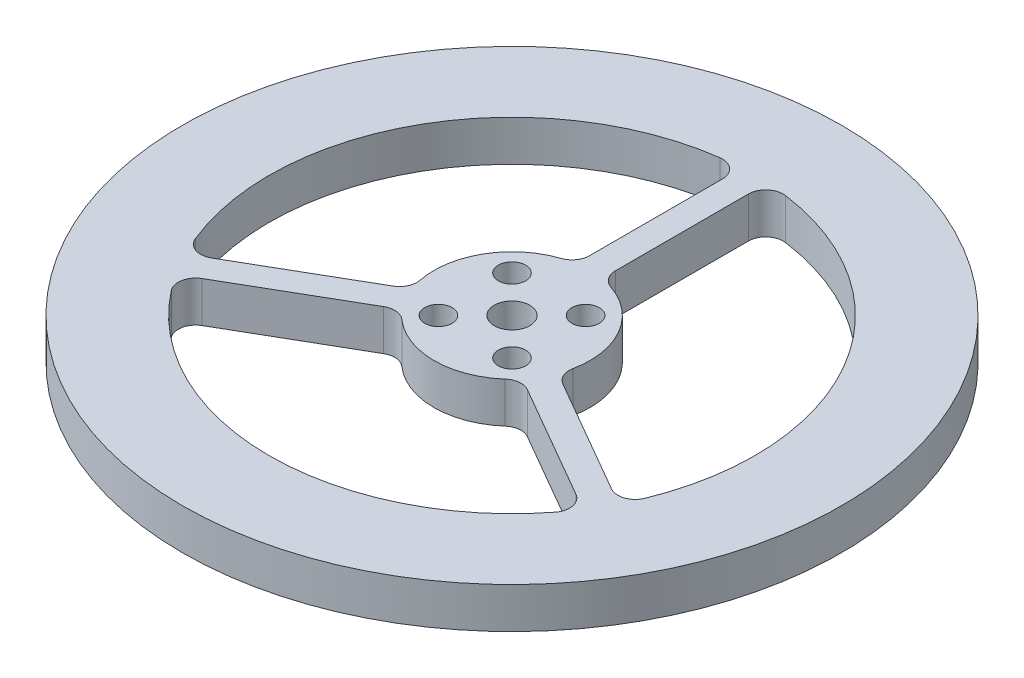
ISO-10303-21;
HEADER;
FILE_DESCRIPTION(('STEP AP214'),'2;1');
FILE_NAME('part.step','',(''),(''),'','','');
FILE_SCHEMA(('AUTOMOTIVE_DESIGN { 1 0 10303 214 1 1 1 1 }'));
ENDSEC;
DATA;
#1=APPLICATION_CONTEXT('core data for automotive mechanical design processes');
#2=APPLICATION_PROTOCOL_DEFINITION('international standard','automotive_design',2000,#1);
#3=PRODUCT_CONTEXT('',#1,'mechanical');
#4=PRODUCT('Part','Part','',(#3));
#5=PRODUCT_RELATED_PRODUCT_CATEGORY('part','',(#4));
#6=PRODUCT_DEFINITION_FORMATION('','',#4);
#7=PRODUCT_DEFINITION_CONTEXT('part definition',#1,'design');
#8=PRODUCT_DEFINITION('design','',#6,#7);
#9=PRODUCT_DEFINITION_SHAPE('','',#8);
#10=(LENGTH_UNIT() NAMED_UNIT(*) SI_UNIT(.MILLI.,.METRE.));
#11=(NAMED_UNIT(*) PLANE_ANGLE_UNIT() SI_UNIT($,.RADIAN.));
#12=(NAMED_UNIT(*) SI_UNIT($,.STERADIAN.) SOLID_ANGLE_UNIT());
#13=UNCERTAINTY_MEASURE_WITH_UNIT(LENGTH_MEASURE(1.E-05),#10,'distance_accuracy_value','');
#14=(GEOMETRIC_REPRESENTATION_CONTEXT(3) GLOBAL_UNCERTAINTY_ASSIGNED_CONTEXT((#13)) GLOBAL_UNIT_ASSIGNED_CONTEXT((#10,
#11,#12)) REPRESENTATION_CONTEXT('',''));
#15=CARTESIAN_POINT('',(0.,0.,0.));
#16=DIRECTION('',(0.,0.,1.));
#17=DIRECTION('',(1.,0.,0.));
#18=AXIS2_PLACEMENT_3D('',#15,#16,#17);
#19=CARTESIAN_POINT('',(0.,4.7,0.));
#20=DIRECTION('',(0.,-1.,0.));
#21=DIRECTION('',(0.,0.,-1.));
#22=AXIS2_PLACEMENT_3D('',#19,#20,#21);
#23=CYLINDRICAL_SURFACE('',#22,28.);
#24=CARTESIAN_POINT('',(0.,4.7,0.));
#25=DIRECTION('',(0.,1.,0.));
#26=DIRECTION('',(0.,0.,1.));
#27=AXIS2_PLACEMENT_3D('',#24,#25,#26);
#28=CIRCLE('',#27,28.);
#29=CARTESIAN_POINT('',(-22.1433823379621,4.7,17.1368205520986));
#30=VERTEX_POINT('',#29);
#31=CARTESIAN_POINT('',(22.143382337963,4.7,17.1368205520975));
#32=VERTEX_POINT('',#31);
#33=EDGE_CURVE('E383',#30,#32,#28,.T.);
#34=ORIENTED_EDGE('',*,*,#33,.T.);
#35=DIRECTION('',(0.,-1.,0.));
#36=VECTOR('',#35,1.);
#37=CARTESIAN_POINT('',(22.143382337963,4.7,17.1368205520975));
#38=LINE('',#37,#36);
#39=CARTESIAN_POINT('',(22.143382337963,0.,17.1368205520975));
#40=VERTEX_POINT('',#39);
#41=EDGE_CURVE('E236',#32,#40,#38,.T.);
#42=ORIENTED_EDGE('',*,*,#41,.T.);
#43=CARTESIAN_POINT('',(0.,0.,0.));
#44=DIRECTION('',(0.,1.,0.));
#45=DIRECTION('',(0.,0.,1.));
#46=AXIS2_PLACEMENT_3D('',#43,#44,#45);
#47=CIRCLE('',#46,28.);
#48=CARTESIAN_POINT('',(-22.1433823379621,0.,17.1368205520986));
#49=VERTEX_POINT('',#48);
#50=EDGE_CURVE('E221',#49,#40,#47,.T.);
#51=ORIENTED_EDGE('',*,*,#50,.F.);
#52=DIRECTION('',(0.,-1.,0.));
#53=VECTOR('',#52,1.);
#54=CARTESIAN_POINT('',(-22.1433823379621,4.7,17.1368205520986));
#55=LINE('',#54,#53);
#56=EDGE_CURVE('E228',#49,#30,#55,.F.);
#57=ORIENTED_EDGE('',*,*,#56,.T.);
#58=EDGE_LOOP('',(#34,#42,#51,#57));
#59=FACE_BOUND('',#58,.T.);
#60=ADVANCED_FACE('F36',(#59),#23,.F.);
#61=CARTESIAN_POINT('',(-3.76923076923076,0.,-27.7451419064362));
#62=VERTEX_POINT('',#61);
#63=CARTESIAN_POINT('',(-25.9126131071931,0.,10.6083213543391));
#64=VERTEX_POINT('',#63);
#65=EDGE_CURVE('E224',#62,#64,#47,.T.);
#66=ORIENTED_EDGE('',*,*,#65,.F.);
#67=DIRECTION('',(0.,-1.,0.));
#68=VECTOR('',#67,1.);
#69=CARTESIAN_POINT('',(-3.76923076923076,4.7,-27.7451419064362));
#70=LINE('',#69,#68);
#71=CARTESIAN_POINT('',(-3.76923076923076,4.7,-27.7451419064362));
#72=VERTEX_POINT('',#71);
#73=EDGE_CURVE('E248',#62,#72,#70,.F.);
#74=ORIENTED_EDGE('',*,*,#73,.T.);
#75=CARTESIAN_POINT('',(-25.9126131071931,4.7,10.6083213543391));
#76=VERTEX_POINT('',#75);
#77=EDGE_CURVE('E380',#72,#76,#28,.T.);
#78=ORIENTED_EDGE('',*,*,#77,.T.);
#79=DIRECTION('',(0.,-1.,0.));
#80=VECTOR('',#79,1.);
#81=CARTESIAN_POINT('',(-25.9126131071931,4.7,10.6083213543391));
#82=LINE('',#81,#80);
#83=EDGE_CURVE('E245',#76,#64,#82,.T.);
#84=ORIENTED_EDGE('',*,*,#83,.T.);
#85=EDGE_LOOP('',(#66,#74,#78,#84));
#86=FACE_BOUND('',#85,.T.);
#87=ADVANCED_FACE('F457',(#86),#23,.F.);
#88=CARTESIAN_POINT('',(0.,30.1558441227157,0.));
#89=DIRECTION('',(0.,-1.,0.));
#90=DIRECTION('',(0.,0.,-1.));
#91=AXIS2_PLACEMENT_3D('',#88,#89,#90);
#92=CYLINDRICAL_SURFACE('',#91,9.);
#93=CARTESIAN_POINT('',(0.,0.,0.));
#94=DIRECTION('',(0.,1.,0.));
#95=DIRECTION('',(0.,0.,1.));
#96=AXIS2_PLACEMENT_3D('',#93,#94,#95);
#97=CIRCLE('',#96,9.);
#98=CARTESIAN_POINT('',(-5.95734212789478,0.,6.74611553200878));
#99=VERTEX_POINT('',#98);
#100=CARTESIAN_POINT('',(5.95734212789561,0.,6.74611553200804));
#101=VERTEX_POINT('',#100);
#102=EDGE_CURVE('E352',#99,#101,#97,.T.);
#103=ORIENTED_EDGE('',*,*,#102,.T.);
#104=DIRECTION('',(0.,-1.,0.));
#105=VECTOR('',#104,1.);
#106=CARTESIAN_POINT('',(5.95734212789561,30.1558441227157,6.74611553200804));
#107=LINE('',#106,#105);
#108=CARTESIAN_POINT('',(5.95734212789561,4.7,6.74611553200804));
#109=VERTEX_POINT('',#108);
#110=EDGE_CURVE('E306',#101,#109,#107,.F.);
#111=ORIENTED_EDGE('',*,*,#110,.T.);
#112=CARTESIAN_POINT('',(0.,4.7,0.));
#113=DIRECTION('',(0.,1.,0.));
#114=DIRECTION('',(0.,0.,1.));
#115=AXIS2_PLACEMENT_3D('',#112,#113,#114);
#116=CIRCLE('',#115,9.);
#117=CARTESIAN_POINT('',(-5.95734212789478,4.7,6.74611553200878));
#118=VERTEX_POINT('',#117);
#119=EDGE_CURVE('E337',#118,#109,#116,.T.);
#120=ORIENTED_EDGE('',*,*,#119,.F.);
#121=DIRECTION('',(0.,-1.,0.));
#122=VECTOR('',#121,1.);
#123=CARTESIAN_POINT('',(-5.95734212789478,30.1558441227157,6.74611553200878));
#124=LINE('',#123,#122);
#125=EDGE_CURVE('E303',#118,#99,#124,.T.);
#126=ORIENTED_EDGE('',*,*,#125,.T.);
#127=EDGE_LOOP('',(#103,#111,#120,#126));
#128=FACE_BOUND('',#127,.T.);
#129=ADVANCED_FACE('F355',(#128),#92,.T.);
#130=CARTESIAN_POINT('',(-2.86363636363636,4.7,-8.53226738779672));
#131=VERTEX_POINT('',#130);
#132=CARTESIAN_POINT('',(-8.82097849153151,4.7,1.78615185578902));
#133=VERTEX_POINT('',#132);
#134=EDGE_CURVE('E376',#131,#133,#116,.T.);
#135=ORIENTED_EDGE('',*,*,#134,.F.);
#136=DIRECTION('',(0.,-1.,0.));
#137=VECTOR('',#136,1.);
#138=CARTESIAN_POINT('',(-2.86363636363636,30.1558441227157,-8.53226738779672));
#139=LINE('',#138,#137);
#140=CARTESIAN_POINT('',(-2.86363636363636,0.,-8.53226738779672));
#141=VERTEX_POINT('',#140);
#142=EDGE_CURVE('E290',#131,#141,#139,.T.);
#143=ORIENTED_EDGE('',*,*,#142,.T.);
#144=CARTESIAN_POINT('',(-8.82097849153151,0.,1.78615185578902));
#145=VERTEX_POINT('',#144);
#146=EDGE_CURVE('E357',#141,#145,#97,.T.);
#147=ORIENTED_EDGE('',*,*,#146,.T.);
#148=DIRECTION('',(0.,-1.,0.));
#149=VECTOR('',#148,1.);
#150=CARTESIAN_POINT('',(-8.82097849153151,30.1558441227157,1.78615185578902));
#151=LINE('',#150,#149);
#152=EDGE_CURVE('E288',#145,#133,#151,.F.);
#153=ORIENTED_EDGE('',*,*,#152,.T.);
#154=EDGE_LOOP('',(#135,#143,#147,#153));
#155=FACE_BOUND('',#154,.T.);
#156=ADVANCED_FACE('F474',(#155),#92,.T.);
#157=CARTESIAN_POINT('',(25.9126131071936,0.,10.6083213543378));
#158=VERTEX_POINT('',#157);
#159=CARTESIAN_POINT('',(3.76923076923076,0.,-27.7451419064362));
#160=VERTEX_POINT('',#159);
#161=EDGE_CURVE('E203',#158,#160,#47,.T.);
#162=ORIENTED_EDGE('',*,*,#161,.F.);
#163=DIRECTION('',(0.,-1.,0.));
#164=VECTOR('',#163,1.);
#165=CARTESIAN_POINT('',(25.9126131071936,4.7,10.6083213543378));
#166=LINE('',#165,#164);
#167=CARTESIAN_POINT('',(25.9126131071936,4.7,10.6083213543378));
#168=VERTEX_POINT('',#167);
#169=EDGE_CURVE('E217',#158,#168,#166,.F.);
#170=ORIENTED_EDGE('',*,*,#169,.T.);
#171=CARTESIAN_POINT('',(3.76923076923076,4.7,-27.7451419064362));
#172=VERTEX_POINT('',#171);
#173=EDGE_CURVE('E384',#168,#172,#28,.T.);
#174=ORIENTED_EDGE('',*,*,#173,.T.);
#175=DIRECTION('',(0.,-1.,0.));
#176=VECTOR('',#175,1.);
#177=CARTESIAN_POINT('',(3.76923076923076,4.7,-27.7451419064362));
#178=LINE('',#177,#176);
#179=EDGE_CURVE('E220',#172,#160,#178,.T.);
#180=ORIENTED_EDGE('',*,*,#179,.T.);
#181=EDGE_LOOP('',(#162,#170,#174,#180));
#182=FACE_BOUND('',#181,.T.);
#183=ADVANCED_FACE('F215',(#182),#23,.F.);
#184=CARTESIAN_POINT('',(8.82097849153173,0.,1.78615185578793));
#185=VERTEX_POINT('',#184);
#186=CARTESIAN_POINT('',(2.86363636363636,0.,-8.53226738779672));
#187=VERTEX_POINT('',#186);
#188=EDGE_CURVE('E358',#185,#187,#97,.T.);
#189=ORIENTED_EDGE('',*,*,#188,.T.);
#190=DIRECTION('',(0.,-1.,0.));
#191=VECTOR('',#190,1.);
#192=CARTESIAN_POINT('',(2.86363636363636,30.1558441227157,-8.53226738779672));
#193=LINE('',#192,#191);
#194=CARTESIAN_POINT('',(2.86363636363636,4.7,-8.53226738779672));
#195=VERTEX_POINT('',#194);
#196=EDGE_CURVE('E286',#187,#195,#193,.F.);
#197=ORIENTED_EDGE('',*,*,#196,.T.);
#198=CARTESIAN_POINT('',(8.82097849153173,4.7,1.78615185578793));
#199=VERTEX_POINT('',#198);
#200=EDGE_CURVE('E361',#199,#195,#116,.T.);
#201=ORIENTED_EDGE('',*,*,#200,.F.);
#202=DIRECTION('',(0.,-1.,0.));
#203=VECTOR('',#202,1.);
#204=CARTESIAN_POINT('',(8.82097849153173,30.1558441227157,1.78615185578793));
#205=LINE('',#204,#203);
#206=EDGE_CURVE('E283',#199,#185,#205,.T.);
#207=ORIENTED_EDGE('',*,*,#206,.T.);
#208=EDGE_LOOP('',(#189,#197,#201,#207));
#209=FACE_BOUND('',#208,.T.);
#210=ADVANCED_FACE('F525',(#209),#92,.T.);
#211=CARTESIAN_POINT('',(0.,4.7,0.));
#212=DIRECTION('',(0.,1.,0.));
#213=DIRECTION('',(0.,0.,1.));
#214=AXIS2_PLACEMENT_3D('',#211,#212,#213);
#215=PLANE('',#214);
#216=ORIENTED_EDGE('',*,*,#33,.F.);
#217=CARTESIAN_POINT('',(-20.5617121709648,4.7,15.9127619412344));
#218=DIRECTION('',(0.,1.,0.));
#219=DIRECTION('',(0.,0.,1.));
#220=AXIS2_PLACEMENT_3D('',#217,#218,#219);
#221=CIRCLE('',#220,2.);
#222=CARTESIAN_POINT('',(-21.5617121709648,4.7,14.1807111336655));
#223=VERTEX_POINT('',#222);
#224=EDGE_CURVE('E276',#30,#223,#221,.F.);
#225=ORIENTED_EDGE('',*,*,#224,.T.);
#226=DIRECTION('',(0.866025403784439,0.,-0.5));
#227=VECTOR('',#226,1.);
#228=CARTESIAN_POINT('',(-24.3647367097482,4.7,15.7990381056772));
#229=LINE('',#228,#227);
#230=CARTESIAN_POINT('',(-8.28119593409362,4.7,6.51320150933074));
#231=VERTEX_POINT('',#230);
#232=EDGE_CURVE('E435',#223,#231,#229,.T.);
#233=ORIENTED_EDGE('',*,*,#232,.T.);
#234=CARTESIAN_POINT('',(-7.28119593409362,4.7,8.24525231689961));
#235=DIRECTION('',(0.,1.,0.));
#236=DIRECTION('',(0.,0.,1.));
#237=AXIS2_PLACEMENT_3D('',#234,#235,#236);
#238=CIRCLE('',#237,2.);
#239=EDGE_CURVE('E11',#231,#118,#238,.F.);
#240=ORIENTED_EDGE('',*,*,#239,.T.);
#241=ORIENTED_EDGE('',*,*,#119,.T.);
#242=CARTESIAN_POINT('',(7.28119593409464,4.7,8.24525231689872));
#243=DIRECTION('',(0.,1.,0.));
#244=DIRECTION('',(0.,0.,1.));
#245=AXIS2_PLACEMENT_3D('',#242,#243,#244);
#246=CIRCLE('',#245,2.);
#247=CARTESIAN_POINT('',(8.28119593409464,4.7,6.51320150932984));
#248=VERTEX_POINT('',#247);
#249=EDGE_CURVE('E327',#109,#248,#246,.F.);
#250=ORIENTED_EDGE('',*,*,#249,.T.);
#251=DIRECTION('',(0.866025403784439,0.,0.499999999999999));
#252=VECTOR('',#251,1.);
#253=CARTESIAN_POINT('',(24.3647367097495,4.7,15.7990381056765));
#254=LINE('',#253,#252);
#255=CARTESIAN_POINT('',(21.5617121709656,4.7,14.1807111336645));
#256=VERTEX_POINT('',#255);
#257=EDGE_CURVE('E335',#248,#256,#254,.T.);
#258=ORIENTED_EDGE('',*,*,#257,.T.);
#259=CARTESIAN_POINT('',(20.5617121709656,4.7,15.9127619412334));
#260=DIRECTION('',(0.,1.,0.));
#261=DIRECTION('',(0.,0.,1.));
#262=AXIS2_PLACEMENT_3D('',#259,#260,#261);
#263=CIRCLE('',#262,2.);
#264=EDGE_CURVE('E261',#256,#32,#263,.F.);
#265=ORIENTED_EDGE('',*,*,#264,.T.);
#266=EDGE_LOOP('',(#216,#225,#233,#240,#241,#250,#258,#265));
#267=FACE_BOUND('',#266,.T.);
#268=ORIENTED_EDGE('',*,*,#134,.T.);
#269=CARTESIAN_POINT('',(-10.7811959340941,4.7,2.1830744904088));
#270=DIRECTION('',(0.,1.,0.));
#271=DIRECTION('',(0.,0.,1.));
#272=AXIS2_PLACEMENT_3D('',#269,#270,#271);
#273=CIRCLE('',#272,2.);
#274=CARTESIAN_POINT('',(-9.78119593409406,4.7,3.91512529797768));
#275=VERTEX_POINT('',#274);
#276=EDGE_CURVE('E319',#133,#275,#273,.F.);
#277=ORIENTED_EDGE('',*,*,#276,.T.);
#278=DIRECTION('',(-0.866025403784438,0.,0.500000000000001));
#279=VECTOR('',#278,1.);
#280=CARTESIAN_POINT('',(-25.8647367097482,4.7,13.2009618943239));
#281=LINE('',#280,#279);
#282=CARTESIAN_POINT('',(-23.061712170965,4.7,11.5826349223123));
#283=VERTEX_POINT('',#282);
#284=EDGE_CURVE('E433',#275,#283,#281,.T.);
#285=ORIENTED_EDGE('',*,*,#284,.T.);
#286=CARTESIAN_POINT('',(-24.061712170965,4.7,9.85058411474344));
#287=DIRECTION('',(0.,1.,0.));
#288=DIRECTION('',(0.,0.,1.));
#289=AXIS2_PLACEMENT_3D('',#286,#287,#288);
#290=CIRCLE('',#289,2.);
#291=EDGE_CURVE('E274',#283,#76,#290,.F.);
#292=ORIENTED_EDGE('',*,*,#291,.T.);
#293=ORIENTED_EDGE('',*,*,#77,.F.);
#294=CARTESIAN_POINT('',(-3.49999999999999,4.7,-25.7633460559765));
#295=DIRECTION('',(0.,1.,0.));
#296=DIRECTION('',(0.,0.,1.));
#297=AXIS2_PLACEMENT_3D('',#294,#295,#296);
#298=CIRCLE('',#297,2.);
#299=CARTESIAN_POINT('',(-1.49999999999999,4.7,-25.7633460559765));
#300=VERTEX_POINT('',#299);
#301=EDGE_CURVE('E267',#72,#300,#298,.F.);
#302=ORIENTED_EDGE('',*,*,#301,.T.);
#303=DIRECTION('',(0.,0.,1.));
#304=VECTOR('',#303,1.);
#305=CARTESIAN_POINT('',(-1.49999999999999,4.7,-29.));
#306=LINE('',#305,#304);
#307=CARTESIAN_POINT('',(-1.5,4.7,-10.4283268073071));
#308=VERTEX_POINT('',#307);
#309=EDGE_CURVE('E222',#300,#308,#306,.T.);
#310=ORIENTED_EDGE('',*,*,#309,.T.);
#311=CARTESIAN_POINT('',(-3.5,4.7,-10.4283268073071));
#312=DIRECTION('',(0.,1.,0.));
#313=DIRECTION('',(0.,0.,1.));
#314=AXIS2_PLACEMENT_3D('',#311,#312,#313);
#315=CIRCLE('',#314,2.);
#316=EDGE_CURVE('E315',#308,#131,#315,.F.);
#317=ORIENTED_EDGE('',*,*,#316,.T.);
#318=EDGE_LOOP('',(#268,#277,#285,#292,#293,#302,#310,#317));
#319=FACE_BOUND('',#318,.T.);
#320=ORIENTED_EDGE('',*,*,#173,.F.);
#321=CARTESIAN_POINT('',(24.0617121709655,4.7,9.85058411474223));
#322=DIRECTION('',(0.,1.,0.));
#323=DIRECTION('',(0.,0.,1.));
#324=AXIS2_PLACEMENT_3D('',#321,#322,#323);
#325=CIRCLE('',#324,2.);
#326=CARTESIAN_POINT('',(23.0617121709655,4.7,11.5826349223111));
#327=VERTEX_POINT('',#326);
#328=EDGE_CURVE('E210',#168,#327,#325,.F.);
#329=ORIENTED_EDGE('',*,*,#328,.T.);
#330=DIRECTION('',(-0.866025403784439,0.,-0.5));
#331=VECTOR('',#330,1.);
#332=CARTESIAN_POINT('',(25.8647367097495,4.7,13.2009618943232));
#333=LINE('',#332,#331);
#334=CARTESIAN_POINT('',(9.78119593409433,4.7,3.91512529797635));
#335=VERTEX_POINT('',#334);
#336=EDGE_CURVE('E347',#327,#335,#333,.T.);
#337=ORIENTED_EDGE('',*,*,#336,.T.);
#338=CARTESIAN_POINT('',(10.7811959340943,4.7,2.18307449040747));
#339=DIRECTION('',(0.,1.,0.));
#340=DIRECTION('',(0.,0.,1.));
#341=AXIS2_PLACEMENT_3D('',#338,#339,#340);
#342=CIRCLE('',#341,2.);
#343=EDGE_CURVE('E323',#335,#199,#342,.F.);
#344=ORIENTED_EDGE('',*,*,#343,.T.);
#345=ORIENTED_EDGE('',*,*,#200,.T.);
#346=CARTESIAN_POINT('',(3.5,4.7,-10.4283268073071));
#347=DIRECTION('',(0.,1.,0.));
#348=DIRECTION('',(0.,0.,1.));
#349=AXIS2_PLACEMENT_3D('',#346,#347,#348);
#350=CIRCLE('',#349,2.);
#351=CARTESIAN_POINT('',(1.5,4.7,-10.4283268073071));
#352=VERTEX_POINT('',#351);
#353=EDGE_CURVE('E311',#195,#352,#350,.F.);
#354=ORIENTED_EDGE('',*,*,#353,.T.);
#355=DIRECTION('',(0.,0.,-1.));
#356=VECTOR('',#355,1.);
#357=CARTESIAN_POINT('',(1.49999999999999,4.7,-29.));
#358=LINE('',#357,#356);
#359=CARTESIAN_POINT('',(1.49999999999999,4.7,-25.7633460559765));
#360=VERTEX_POINT('',#359);
#361=EDGE_CURVE('E372',#352,#360,#358,.T.);
#362=ORIENTED_EDGE('',*,*,#361,.T.);
#363=CARTESIAN_POINT('',(3.49999999999999,4.7,-25.7633460559765));
#364=DIRECTION('',(0.,1.,0.));
#365=DIRECTION('',(0.,0.,1.));
#366=AXIS2_PLACEMENT_3D('',#363,#364,#365);
#367=CIRCLE('',#366,2.);
#368=EDGE_CURVE('E265',#360,#172,#367,.F.);
#369=ORIENTED_EDGE('',*,*,#368,.T.);
#370=EDGE_LOOP('',(#320,#329,#337,#344,#345,#354,#362,#369));
#371=FACE_BOUND('',#370,.T.);
#372=CARTESIAN_POINT('',(0.,4.7,0.));
#373=DIRECTION('',(0.,1.,0.));
#374=DIRECTION('',(0.,0.,1.));
#375=AXIS2_PLACEMENT_3D('',#372,#373,#374);
#376=CIRCLE('',#375,38.);
#377=CARTESIAN_POINT('',(0.,4.7,38.));
#378=VERTEX_POINT('',#377);
#379=EDGE_CURVE('E230',#378,#378,#376,.T.);
#380=ORIENTED_EDGE('',*,*,#379,.T.);
#381=EDGE_LOOP('',(#380));
#382=FACE_BOUND('',#381,.T.);
#383=CARTESIAN_POINT('',(0.,4.7,0.));
#384=DIRECTION('',(0.,1.,0.));
#385=DIRECTION('',(0.,0.,1.));
#386=AXIS2_PLACEMENT_3D('',#383,#384,#385);
#387=CIRCLE('',#386,2.05);
#388=CARTESIAN_POINT('',(0.,4.7,2.05));
#389=VERTEX_POINT('',#388);
#390=EDGE_CURVE('E414',#389,#389,#387,.T.);
#391=ORIENTED_EDGE('',*,*,#390,.F.);
#392=EDGE_LOOP('',(#391));
#393=FACE_BOUND('',#392,.T.);
#394=CARTESIAN_POINT('',(-4.24264068711929,4.7,-4.24264068711928));
#395=DIRECTION('',(0.,1.,0.));
#396=DIRECTION('',(0.,0.,1.));
#397=AXIS2_PLACEMENT_3D('',#394,#395,#396);
#398=CIRCLE('',#397,1.575);
#399=CARTESIAN_POINT('',(-4.24264068711929,4.7,-2.66764068711928));
#400=VERTEX_POINT('',#399);
#401=EDGE_CURVE('E418',#400,#400,#398,.T.);
#402=ORIENTED_EDGE('',*,*,#401,.F.);
#403=EDGE_LOOP('',(#402));
#404=FACE_BOUND('',#403,.T.);
#405=CARTESIAN_POINT('',(-4.24264068711928,4.7,4.24264068711929));
#406=DIRECTION('',(0.,1.,0.));
#407=DIRECTION('',(0.,0.,1.));
#408=AXIS2_PLACEMENT_3D('',#405,#406,#407);
#409=CIRCLE('',#408,1.575);
#410=CARTESIAN_POINT('',(-4.24264068711928,4.7,5.81764068711929));
#411=VERTEX_POINT('',#410);
#412=EDGE_CURVE('E425',#411,#411,#409,.T.);
#413=ORIENTED_EDGE('',*,*,#412,.F.);
#414=EDGE_LOOP('',(#413));
#415=FACE_BOUND('',#414,.T.);
#416=CARTESIAN_POINT('',(4.24264068711929,4.7,4.24264068711927));
#417=DIRECTION('',(0.,1.,0.));
#418=DIRECTION('',(0.,0.,1.));
#419=AXIS2_PLACEMENT_3D('',#416,#417,#418);
#420=CIRCLE('',#419,1.575);
#421=CARTESIAN_POINT('',(4.24264068711929,4.7,5.81764068711927));
#422=VERTEX_POINT('',#421);
#423=EDGE_CURVE('E369',#422,#422,#420,.T.);
#424=ORIENTED_EDGE('',*,*,#423,.F.);
#425=EDGE_LOOP('',(#424));
#426=FACE_BOUND('',#425,.T.);
#427=CARTESIAN_POINT('',(4.24264068711927,4.7,-4.2426406871193));
#428=DIRECTION('',(0.,1.,0.));
#429=DIRECTION('',(0.,0.,1.));
#430=AXIS2_PLACEMENT_3D('',#427,#428,#429);
#431=CIRCLE('',#430,1.575);
#432=CARTESIAN_POINT('',(4.24264068711927,4.7,-2.6676406871193));
#433=VERTEX_POINT('',#432);
#434=EDGE_CURVE('E346',#433,#433,#431,.T.);
#435=ORIENTED_EDGE('',*,*,#434,.F.);
#436=EDGE_LOOP('',(#435));
#437=FACE_BOUND('',#436,.T.);
#438=ADVANCED_FACE('F333',(#267,#319,#371,#382,#393,#404,#415,#426,#437),#215,.T.);
#439=CARTESIAN_POINT('',(0.,0.,0.));
#440=DIRECTION('',(0.,1.,0.));
#441=DIRECTION('',(0.,0.,1.));
#442=AXIS2_PLACEMENT_3D('',#439,#440,#441);
#443=PLANE('',#442);
#444=DIRECTION('',(0.866025403784439,0.,-0.5));
#445=VECTOR('',#444,1.);
#446=CARTESIAN_POINT('',(-24.3647367097482,0.,15.7990381056772));
#447=LINE('',#446,#445);
#448=CARTESIAN_POINT('',(-21.5617121709648,0.,14.1807111336655));
#449=VERTEX_POINT('',#448);
#450=CARTESIAN_POINT('',(-8.28119593409362,0.,6.51320150933074));
#451=VERTEX_POINT('',#450);
#452=EDGE_CURVE('E439',#449,#451,#447,.T.);
#453=ORIENTED_EDGE('',*,*,#452,.F.);
#454=CARTESIAN_POINT('',(-20.5617121709648,0.,15.9127619412344));
#455=DIRECTION('',(0.,1.,0.));
#456=DIRECTION('',(0.,0.,1.));
#457=AXIS2_PLACEMENT_3D('',#454,#455,#456);
#458=CIRCLE('',#457,2.);
#459=EDGE_CURVE('E278',#449,#49,#458,.T.);
#460=ORIENTED_EDGE('',*,*,#459,.T.);
#461=ORIENTED_EDGE('',*,*,#50,.T.);
#462=CARTESIAN_POINT('',(20.5617121709656,0.,15.9127619412334));
#463=DIRECTION('',(0.,1.,0.));
#464=DIRECTION('',(0.,0.,1.));
#465=AXIS2_PLACEMENT_3D('',#462,#463,#464);
#466=CIRCLE('',#465,2.);
#467=CARTESIAN_POINT('',(21.5617121709656,0.,14.1807111336645));
#468=VERTEX_POINT('',#467);
#469=EDGE_CURVE('E209',#40,#468,#466,.T.);
#470=ORIENTED_EDGE('',*,*,#469,.T.);
#471=DIRECTION('',(0.866025403784439,0.,0.499999999999999));
#472=VECTOR('',#471,1.);
#473=CARTESIAN_POINT('',(24.3647367097495,0.,15.7990381056765));
#474=LINE('',#473,#472);
#475=CARTESIAN_POINT('',(8.28119593409464,0.,6.51320150932984));
#476=VERTEX_POINT('',#475);
#477=EDGE_CURVE('E353',#476,#468,#474,.T.);
#478=ORIENTED_EDGE('',*,*,#477,.F.);
#479=CARTESIAN_POINT('',(7.28119593409464,0.,8.24525231689872));
#480=DIRECTION('',(0.,1.,0.));
#481=DIRECTION('',(0.,0.,1.));
#482=AXIS2_PLACEMENT_3D('',#479,#480,#481);
#483=CIRCLE('',#482,2.);
#484=EDGE_CURVE('E325',#476,#101,#483,.T.);
#485=ORIENTED_EDGE('',*,*,#484,.T.);
#486=ORIENTED_EDGE('',*,*,#102,.F.);
#487=CARTESIAN_POINT('',(-7.28119593409362,0.,8.24525231689961));
#488=DIRECTION('',(0.,1.,0.));
#489=DIRECTION('',(0.,0.,1.));
#490=AXIS2_PLACEMENT_3D('',#487,#488,#489);
#491=CIRCLE('',#490,2.);
#492=EDGE_CURVE('E44',#99,#451,#491,.T.);
#493=ORIENTED_EDGE('',*,*,#492,.T.);
#494=EDGE_LOOP('',(#453,#460,#461,#470,#478,#485,#486,#493));
#495=FACE_BOUND('',#494,.T.);
#496=DIRECTION('',(0.,0.,1.));
#497=VECTOR('',#496,1.);
#498=CARTESIAN_POINT('',(-1.49999999999999,0.,-29.));
#499=LINE('',#498,#497);
#500=CARTESIAN_POINT('',(-1.49999999999999,0.,-25.7633460559765));
#501=VERTEX_POINT('',#500);
#502=CARTESIAN_POINT('',(-1.5,0.,-10.4283268073071));
#503=VERTEX_POINT('',#502);
#504=EDGE_CURVE('E373',#501,#503,#499,.T.);
#505=ORIENTED_EDGE('',*,*,#504,.F.);
#506=CARTESIAN_POINT('',(-3.49999999999999,0.,-25.7633460559765));
#507=DIRECTION('',(0.,1.,0.));
#508=DIRECTION('',(0.,0.,1.));
#509=AXIS2_PLACEMENT_3D('',#506,#507,#508);
#510=CIRCLE('',#509,2.);
#511=EDGE_CURVE('E269',#501,#62,#510,.T.);
#512=ORIENTED_EDGE('',*,*,#511,.T.);
#513=ORIENTED_EDGE('',*,*,#65,.T.);
#514=CARTESIAN_POINT('',(-24.061712170965,0.,9.85058411474344));
#515=DIRECTION('',(0.,1.,0.));
#516=DIRECTION('',(0.,0.,1.));
#517=AXIS2_PLACEMENT_3D('',#514,#515,#516);
#518=CIRCLE('',#517,2.);
#519=CARTESIAN_POINT('',(-23.061712170965,0.,11.5826349223123));
#520=VERTEX_POINT('',#519);
#521=EDGE_CURVE('E271',#64,#520,#518,.T.);
#522=ORIENTED_EDGE('',*,*,#521,.T.);
#523=DIRECTION('',(-0.866025403784438,0.,0.500000000000001));
#524=VECTOR('',#523,1.);
#525=CARTESIAN_POINT('',(-25.8647367097482,0.,13.2009618943239));
#526=LINE('',#525,#524);
#527=CARTESIAN_POINT('',(-9.78119593409406,0.,3.91512529797768));
#528=VERTEX_POINT('',#527);
#529=EDGE_CURVE('E437',#528,#520,#526,.T.);
#530=ORIENTED_EDGE('',*,*,#529,.F.);
#531=CARTESIAN_POINT('',(-10.7811959340941,0.,2.1830744904088));
#532=DIRECTION('',(0.,1.,0.));
#533=DIRECTION('',(0.,0.,1.));
#534=AXIS2_PLACEMENT_3D('',#531,#532,#533);
#535=CIRCLE('',#534,2.);
#536=EDGE_CURVE('E317',#528,#145,#535,.T.);
#537=ORIENTED_EDGE('',*,*,#536,.T.);
#538=ORIENTED_EDGE('',*,*,#146,.F.);
#539=CARTESIAN_POINT('',(-3.5,0.,-10.4283268073071));
#540=DIRECTION('',(0.,1.,0.));
#541=DIRECTION('',(0.,0.,1.));
#542=AXIS2_PLACEMENT_3D('',#539,#540,#541);
#543=CIRCLE('',#542,2.);
#544=EDGE_CURVE('E313',#141,#503,#543,.T.);
#545=ORIENTED_EDGE('',*,*,#544,.T.);
#546=EDGE_LOOP('',(#505,#512,#513,#522,#530,#537,#538,#545));
#547=FACE_BOUND('',#546,.T.);
#548=DIRECTION('',(-0.866025403784438,0.,-0.5));
#549=VECTOR('',#548,1.);
#550=CARTESIAN_POINT('',(25.8647367097495,0.,13.2009618943232));
#551=LINE('',#550,#549);
#552=CARTESIAN_POINT('',(23.0617121709655,0.,11.5826349223111));
#553=VERTEX_POINT('',#552);
#554=CARTESIAN_POINT('',(9.78119593409433,0.,3.91512529797635));
#555=VERTEX_POINT('',#554);
#556=EDGE_CURVE('E205',#553,#555,#551,.T.);
#557=ORIENTED_EDGE('',*,*,#556,.F.);
#558=CARTESIAN_POINT('',(24.0617121709655,0.,9.85058411474223));
#559=DIRECTION('',(0.,1.,0.));
#560=DIRECTION('',(0.,0.,1.));
#561=AXIS2_PLACEMENT_3D('',#558,#559,#560);
#562=CIRCLE('',#561,2.);
#563=EDGE_CURVE('E198',#553,#158,#562,.T.);
#564=ORIENTED_EDGE('',*,*,#563,.T.);
#565=ORIENTED_EDGE('',*,*,#161,.T.);
#566=CARTESIAN_POINT('',(3.49999999999999,0.,-25.7633460559765));
#567=DIRECTION('',(0.,1.,0.));
#568=DIRECTION('',(0.,0.,1.));
#569=AXIS2_PLACEMENT_3D('',#566,#567,#568);
#570=CIRCLE('',#569,2.);
#571=CARTESIAN_POINT('',(1.49999999999999,0.,-25.7633460559765));
#572=VERTEX_POINT('',#571);
#573=EDGE_CURVE('E263',#160,#572,#570,.T.);
#574=ORIENTED_EDGE('',*,*,#573,.T.);
#575=DIRECTION('',(0.,0.,-1.));
#576=VECTOR('',#575,1.);
#577=CARTESIAN_POINT('',(1.49999999999999,0.,-29.));
#578=LINE('',#577,#576);
#579=CARTESIAN_POINT('',(1.5,0.,-10.4283268073071));
#580=VERTEX_POINT('',#579);
#581=EDGE_CURVE('E370',#580,#572,#578,.T.);
#582=ORIENTED_EDGE('',*,*,#581,.F.);
#583=CARTESIAN_POINT('',(3.5,0.,-10.4283268073071));
#584=DIRECTION('',(0.,1.,0.));
#585=DIRECTION('',(0.,0.,1.));
#586=AXIS2_PLACEMENT_3D('',#583,#584,#585);
#587=CIRCLE('',#586,2.);
#588=EDGE_CURVE('E309',#580,#187,#587,.T.);
#589=ORIENTED_EDGE('',*,*,#588,.T.);
#590=ORIENTED_EDGE('',*,*,#188,.F.);
#591=CARTESIAN_POINT('',(10.7811959340943,0.,2.18307449040747));
#592=DIRECTION('',(0.,1.,0.));
#593=DIRECTION('',(0.,0.,1.));
#594=AXIS2_PLACEMENT_3D('',#591,#592,#593);
#595=CIRCLE('',#594,2.);
#596=EDGE_CURVE('E321',#185,#555,#595,.T.);
#597=ORIENTED_EDGE('',*,*,#596,.T.);
#598=EDGE_LOOP('',(#557,#564,#565,#574,#582,#589,#590,#597));
#599=FACE_BOUND('',#598,.T.);
#600=CARTESIAN_POINT('',(0.,0.,0.));
#601=DIRECTION('',(0.,1.,0.));
#602=DIRECTION('',(0.,0.,1.));
#603=AXIS2_PLACEMENT_3D('',#600,#601,#602);
#604=CIRCLE('',#603,38.);
#605=CARTESIAN_POINT('',(0.,0.,38.));
#606=VERTEX_POINT('',#605);
#607=EDGE_CURVE('E382',#606,#606,#604,.T.);
#608=ORIENTED_EDGE('',*,*,#607,.F.);
#609=EDGE_LOOP('',(#608));
#610=FACE_BOUND('',#609,.T.);
#611=CARTESIAN_POINT('',(0.,0.,0.));
#612=DIRECTION('',(0.,1.,0.));
#613=DIRECTION('',(0.,0.,1.));
#614=AXIS2_PLACEMENT_3D('',#611,#612,#613);
#615=CIRCLE('',#614,2.05);
#616=CARTESIAN_POINT('',(0.,0.,2.05));
#617=VERTEX_POINT('',#616);
#618=EDGE_CURVE('E363',#617,#617,#615,.T.);
#619=ORIENTED_EDGE('',*,*,#618,.T.);
#620=EDGE_LOOP('',(#619));
#621=FACE_BOUND('',#620,.T.);
#622=CARTESIAN_POINT('',(-4.24264068711929,0.,-4.24264068711928));
#623=DIRECTION('',(0.,1.,0.));
#624=DIRECTION('',(0.,0.,1.));
#625=AXIS2_PLACEMENT_3D('',#622,#623,#624);
#626=CIRCLE('',#625,1.575);
#627=CARTESIAN_POINT('',(-4.24264068711929,0.,-2.66764068711928));
#628=VERTEX_POINT('',#627);
#629=EDGE_CURVE('E401',#628,#628,#626,.T.);
#630=ORIENTED_EDGE('',*,*,#629,.T.);
#631=EDGE_LOOP('',(#630));
#632=FACE_BOUND('',#631,.T.);
#633=CARTESIAN_POINT('',(-4.24264068711928,0.,4.24264068711929));
#634=DIRECTION('',(0.,1.,0.));
#635=DIRECTION('',(0.,0.,1.));
#636=AXIS2_PLACEMENT_3D('',#633,#634,#635);
#637=CIRCLE('',#636,1.575);
#638=CARTESIAN_POINT('',(-4.24264068711928,0.,5.81764068711929));
#639=VERTEX_POINT('',#638);
#640=EDGE_CURVE('E405',#639,#639,#637,.T.);
#641=ORIENTED_EDGE('',*,*,#640,.T.);
#642=EDGE_LOOP('',(#641));
#643=FACE_BOUND('',#642,.T.);
#644=CARTESIAN_POINT('',(4.24264068711929,0.,4.24264068711927));
#645=DIRECTION('',(0.,1.,0.));
#646=DIRECTION('',(0.,0.,1.));
#647=AXIS2_PLACEMENT_3D('',#644,#645,#646);
#648=CIRCLE('',#647,1.575);
#649=CARTESIAN_POINT('',(4.24264068711929,0.,5.81764068711927));
#650=VERTEX_POINT('',#649);
#651=EDGE_CURVE('E409',#650,#650,#648,.T.);
#652=ORIENTED_EDGE('',*,*,#651,.T.);
#653=EDGE_LOOP('',(#652));
#654=FACE_BOUND('',#653,.T.);
#655=CARTESIAN_POINT('',(4.24264068711927,0.,-4.2426406871193));
#656=DIRECTION('',(0.,1.,0.));
#657=DIRECTION('',(0.,0.,1.));
#658=AXIS2_PLACEMENT_3D('',#655,#656,#657);
#659=CIRCLE('',#658,1.575);
#660=CARTESIAN_POINT('',(4.24264068711927,0.,-2.6676406871193));
#661=VERTEX_POINT('',#660);
#662=EDGE_CURVE('E412',#661,#661,#659,.T.);
#663=ORIENTED_EDGE('',*,*,#662,.T.);
#664=EDGE_LOOP('',(#663));
#665=FACE_BOUND('',#664,.T.);
#666=ADVANCED_FACE('F200',(#495,#547,#599,#610,#621,#632,#643,#654,#665),#443,.F.);
#667=CARTESIAN_POINT('',(0.,4.7,0.));
#668=DIRECTION('',(0.,-1.,0.));
#669=DIRECTION('',(0.,0.,-1.));
#670=AXIS2_PLACEMENT_3D('',#667,#668,#669);
#671=CYLINDRICAL_SURFACE('',#670,38.);
#672=ORIENTED_EDGE('',*,*,#379,.F.);
#673=EDGE_LOOP('',(#672));
#674=FACE_BOUND('',#673,.T.);
#675=ORIENTED_EDGE('',*,*,#607,.T.);
#676=EDGE_LOOP('',(#675));
#677=FACE_BOUND('',#676,.T.);
#678=ADVANCED_FACE('F391',(#674,#677),#671,.T.);
#679=CARTESIAN_POINT('',(-1.49999999999999,27.4734099484905,-29.));
#680=DIRECTION('',(1.,0.,0.));
#681=DIRECTION('',(0.,0.,-1.));
#682=AXIS2_PLACEMENT_3D('',#679,#680,#681);
#683=PLANE('',#682);
#684=ORIENTED_EDGE('',*,*,#504,.T.);
#685=DIRECTION('',(0.,1.,0.));
#686=VECTOR('',#685,1.);
#687=CARTESIAN_POINT('',(-1.5,4.7,-10.4283268073071));
#688=LINE('',#687,#686);
#689=EDGE_CURVE('E293',#503,#308,#688,.T.);
#690=ORIENTED_EDGE('',*,*,#689,.T.);
#691=ORIENTED_EDGE('',*,*,#309,.F.);
#692=DIRECTION('',(0.,-1.,0.));
#693=VECTOR('',#692,1.);
#694=CARTESIAN_POINT('',(-1.49999999999999,27.4734099484905,-25.7633460559765));
#695=LINE('',#694,#693);
#696=EDGE_CURVE('E251',#300,#501,#695,.T.);
#697=ORIENTED_EDGE('',*,*,#696,.T.);
#698=EDGE_LOOP('',(#684,#690,#691,#697));
#699=FACE_BOUND('',#698,.T.);
#700=ADVANCED_FACE('F466',(#699),#683,.F.);
#701=CARTESIAN_POINT('',(1.49999999999999,27.4734099484905,-29.));
#702=DIRECTION('',(-1.,0.,0.));
#703=DIRECTION('',(0.,0.,1.));
#704=AXIS2_PLACEMENT_3D('',#701,#702,#703);
#705=PLANE('',#704);
#706=ORIENTED_EDGE('',*,*,#361,.F.);
#707=DIRECTION('',(0.,1.,0.));
#708=VECTOR('',#707,1.);
#709=CARTESIAN_POINT('',(1.5,0.,-10.4283268073071));
#710=LINE('',#709,#708);
#711=EDGE_CURVE('E280',#352,#580,#710,.F.);
#712=ORIENTED_EDGE('',*,*,#711,.T.);
#713=ORIENTED_EDGE('',*,*,#581,.T.);
#714=DIRECTION('',(0.,-1.,0.));
#715=VECTOR('',#714,1.);
#716=CARTESIAN_POINT('',(1.49999999999999,27.4734099484905,-25.7633460559765));
#717=LINE('',#716,#715);
#718=EDGE_CURVE('E242',#572,#360,#717,.F.);
#719=ORIENTED_EDGE('',*,*,#718,.T.);
#720=EDGE_LOOP('',(#706,#712,#713,#719));
#721=FACE_BOUND('',#720,.T.);
#722=ADVANCED_FACE('F491',(#721),#705,.F.);
#723=CARTESIAN_POINT('',(4.24264068711929,30.1558441227157,4.24264068711927));
#724=DIRECTION('',(0.,-1.,0.));
#725=DIRECTION('',(0.,0.,-1.));
#726=AXIS2_PLACEMENT_3D('',#723,#724,#725);
#727=CYLINDRICAL_SURFACE('',#726,1.575);
#728=ORIENTED_EDGE('',*,*,#651,.F.);
#729=EDGE_LOOP('',(#728));
#730=FACE_BOUND('',#729,.T.);
#731=ORIENTED_EDGE('',*,*,#423,.T.);
#732=EDGE_LOOP('',(#731));
#733=FACE_BOUND('',#732,.T.);
#734=ADVANCED_FACE('F539',(#730,#733),#727,.F.);
#735=CARTESIAN_POINT('',(-4.24264068711928,30.1558441227157,4.24264068711929));
#736=DIRECTION('',(0.,-1.,0.));
#737=DIRECTION('',(0.,0.,-1.));
#738=AXIS2_PLACEMENT_3D('',#735,#736,#737);
#739=CYLINDRICAL_SURFACE('',#738,1.575);
#740=ORIENTED_EDGE('',*,*,#640,.F.);
#741=EDGE_LOOP('',(#740));
#742=FACE_BOUND('',#741,.T.);
#743=ORIENTED_EDGE('',*,*,#412,.T.);
#744=EDGE_LOOP('',(#743));
#745=FACE_BOUND('',#744,.T.);
#746=ADVANCED_FACE('F591',(#742,#745),#739,.F.);
#747=CARTESIAN_POINT('',(-4.24264068711929,30.1558441227157,-4.24264068711928));
#748=DIRECTION('',(0.,-1.,0.));
#749=DIRECTION('',(0.,0.,-1.));
#750=AXIS2_PLACEMENT_3D('',#747,#748,#749);
#751=CYLINDRICAL_SURFACE('',#750,1.575);
#752=ORIENTED_EDGE('',*,*,#629,.F.);
#753=EDGE_LOOP('',(#752));
#754=FACE_BOUND('',#753,.T.);
#755=ORIENTED_EDGE('',*,*,#401,.T.);
#756=EDGE_LOOP('',(#755));
#757=FACE_BOUND('',#756,.T.);
#758=ADVANCED_FACE('F594',(#754,#757),#751,.F.);
#759=CARTESIAN_POINT('',(0.,30.1558441227157,0.));
#760=DIRECTION('',(0.,-1.,0.));
#761=DIRECTION('',(0.,0.,-1.));
#762=AXIS2_PLACEMENT_3D('',#759,#760,#761);
#763=CYLINDRICAL_SURFACE('',#762,2.05);
#764=ORIENTED_EDGE('',*,*,#618,.F.);
#765=EDGE_LOOP('',(#764));
#766=FACE_BOUND('',#765,.T.);
#767=ORIENTED_EDGE('',*,*,#390,.T.);
#768=EDGE_LOOP('',(#767));
#769=FACE_BOUND('',#768,.T.);
#770=ADVANCED_FACE('F536',(#766,#769),#763,.F.);
#771=CARTESIAN_POINT('',(4.24264068711927,30.1558441227157,-4.2426406871193));
#772=DIRECTION('',(0.,-1.,0.));
#773=DIRECTION('',(0.,0.,-1.));
#774=AXIS2_PLACEMENT_3D('',#771,#772,#773);
#775=CYLINDRICAL_SURFACE('',#774,1.575);
#776=ORIENTED_EDGE('',*,*,#662,.F.);
#777=EDGE_LOOP('',(#776));
#778=FACE_BOUND('',#777,.T.);
#779=ORIENTED_EDGE('',*,*,#434,.T.);
#780=EDGE_LOOP('',(#779));
#781=FACE_BOUND('',#780,.T.);
#782=ADVANCED_FACE('F579',(#778,#781),#775,.F.);
#783=CARTESIAN_POINT('',(25.8647367097495,27.4734099484905,13.2009618943232));
#784=DIRECTION('',(-0.5,0.,0.866025403784438));
#785=DIRECTION('',(0.866025403784439,0.,0.5));
#786=AXIS2_PLACEMENT_3D('',#783,#784,#785);
#787=PLANE('',#786);
#788=ORIENTED_EDGE('',*,*,#556,.T.);
#789=DIRECTION('',(0.,1.,0.));
#790=VECTOR('',#789,1.);
#791=CARTESIAN_POINT('',(9.78119593409433,4.7,3.91512529797635));
#792=LINE('',#791,#790);
#793=EDGE_CURVE('E298',#555,#335,#792,.T.);
#794=ORIENTED_EDGE('',*,*,#793,.T.);
#795=ORIENTED_EDGE('',*,*,#336,.F.);
#796=DIRECTION('',(0.,-1.,0.));
#797=VECTOR('',#796,1.);
#798=CARTESIAN_POINT('',(23.0617121709655,27.4734099484905,11.5826349223111));
#799=LINE('',#798,#797);
#800=EDGE_CURVE('E226',#327,#553,#799,.T.);
#801=ORIENTED_EDGE('',*,*,#800,.T.);
#802=EDGE_LOOP('',(#788,#794,#795,#801));
#803=FACE_BOUND('',#802,.T.);
#804=ADVANCED_FACE('F576',(#803),#787,.F.);
#805=CARTESIAN_POINT('',(24.3647367097495,27.4734099484905,15.7990381056765));
#806=DIRECTION('',(0.499999999999999,0.,-0.866025403784439));
#807=DIRECTION('',(-0.866025403784439,0.,-0.499999999999999));
#808=AXIS2_PLACEMENT_3D('',#805,#806,#807);
#809=PLANE('',#808);
#810=ORIENTED_EDGE('',*,*,#257,.F.);
#811=DIRECTION('',(0.,1.,0.));
#812=VECTOR('',#811,1.);
#813=CARTESIAN_POINT('',(8.28119593409463,0.,6.51320150932984));
#814=LINE('',#813,#812);
#815=EDGE_CURVE('E300',#248,#476,#814,.F.);
#816=ORIENTED_EDGE('',*,*,#815,.T.);
#817=ORIENTED_EDGE('',*,*,#477,.T.);
#818=DIRECTION('',(0.,-1.,0.));
#819=VECTOR('',#818,1.);
#820=CARTESIAN_POINT('',(21.5617121709656,27.4734099484905,14.1807111336645));
#821=LINE('',#820,#819);
#822=EDGE_CURVE('E239',#468,#256,#821,.F.);
#823=ORIENTED_EDGE('',*,*,#822,.T.);
#824=EDGE_LOOP('',(#810,#816,#817,#823));
#825=FACE_BOUND('',#824,.T.);
#826=ADVANCED_FACE('F342',(#825),#809,.F.);
#827=CARTESIAN_POINT('',(-24.3647367097482,27.4734099484905,15.7990381056772));
#828=DIRECTION('',(-0.5,0.,-0.866025403784438));
#829=DIRECTION('',(-0.866025403784439,0.,0.5));
#830=AXIS2_PLACEMENT_3D('',#827,#828,#829);
#831=PLANE('',#830);
#832=ORIENTED_EDGE('',*,*,#452,.T.);
#833=DIRECTION('',(0.,1.,0.));
#834=VECTOR('',#833,1.);
#835=CARTESIAN_POINT('',(-8.28119593409362,4.7,6.51320150933074));
#836=LINE('',#835,#834);
#837=EDGE_CURVE('E57',#451,#231,#836,.T.);
#838=ORIENTED_EDGE('',*,*,#837,.T.);
#839=ORIENTED_EDGE('',*,*,#232,.F.);
#840=DIRECTION('',(0.,-1.,0.));
#841=VECTOR('',#840,1.);
#842=CARTESIAN_POINT('',(-21.5617121709648,27.4734099484905,14.1807111336655));
#843=LINE('',#842,#841);
#844=EDGE_CURVE('E256',#223,#449,#843,.T.);
#845=ORIENTED_EDGE('',*,*,#844,.T.);
#846=EDGE_LOOP('',(#832,#838,#839,#845));
#847=FACE_BOUND('',#846,.T.);
#848=ADVANCED_FACE('F510',(#847),#831,.F.);
#849=CARTESIAN_POINT('',(-25.8647367097482,27.4734099484905,13.2009618943239));
#850=DIRECTION('',(0.500000000000001,0.,0.866025403784438));
#851=DIRECTION('',(0.866025403784438,0.,-0.500000000000001));
#852=AXIS2_PLACEMENT_3D('',#849,#850,#851);
#853=PLANE('',#852);
#854=ORIENTED_EDGE('',*,*,#284,.F.);
#855=DIRECTION('',(0.,1.,0.));
#856=VECTOR('',#855,1.);
#857=CARTESIAN_POINT('',(-9.78119593409406,0.,3.91512529797767));
#858=LINE('',#857,#856);
#859=EDGE_CURVE('E295',#275,#528,#858,.F.);
#860=ORIENTED_EDGE('',*,*,#859,.T.);
#861=ORIENTED_EDGE('',*,*,#529,.T.);
#862=DIRECTION('',(0.,-1.,0.));
#863=VECTOR('',#862,1.);
#864=CARTESIAN_POINT('',(-23.061712170965,27.4734099484905,11.5826349223123));
#865=LINE('',#864,#863);
#866=EDGE_CURVE('E253',#520,#283,#865,.F.);
#867=ORIENTED_EDGE('',*,*,#866,.T.);
#868=EDGE_LOOP('',(#854,#860,#861,#867));
#869=FACE_BOUND('',#868,.T.);
#870=ADVANCED_FACE('F444',(#869),#853,.F.);
#871=CARTESIAN_POINT('',(24.0617121709655,4.7,9.85058411474223));
#872=DIRECTION('',(0.,-1.,0.));
#873=DIRECTION('',(0.,0.,-1.));
#874=AXIS2_PLACEMENT_3D('',#871,#872,#873);
#875=CYLINDRICAL_SURFACE('',#874,2.);
#876=ORIENTED_EDGE('',*,*,#563,.F.);
#877=ORIENTED_EDGE('',*,*,#800,.F.);
#878=ORIENTED_EDGE('',*,*,#328,.F.);
#879=ORIENTED_EDGE('',*,*,#169,.F.);
#880=EDGE_LOOP('',(#876,#877,#878,#879));
#881=FACE_BOUND('',#880,.T.);
#882=ADVANCED_FACE('F225',(#881),#875,.F.);
#883=CARTESIAN_POINT('',(20.5617121709656,4.7,15.9127619412334));
#884=DIRECTION('',(0.,-1.,0.));
#885=DIRECTION('',(0.,0.,-1.));
#886=AXIS2_PLACEMENT_3D('',#883,#884,#885);
#887=CYLINDRICAL_SURFACE('',#886,2.);
#888=ORIENTED_EDGE('',*,*,#264,.F.);
#889=ORIENTED_EDGE('',*,*,#822,.F.);
#890=ORIENTED_EDGE('',*,*,#469,.F.);
#891=ORIENTED_EDGE('',*,*,#41,.F.);
#892=EDGE_LOOP('',(#888,#889,#890,#891));
#893=FACE_BOUND('',#892,.T.);
#894=ADVANCED_FACE('F504',(#893),#887,.F.);
#895=CARTESIAN_POINT('',(3.49999999999999,4.7,-25.7633460559765));
#896=DIRECTION('',(0.,-1.,0.));
#897=DIRECTION('',(0.,0.,-1.));
#898=AXIS2_PLACEMENT_3D('',#895,#896,#897);
#899=CYLINDRICAL_SURFACE('',#898,2.);
#900=ORIENTED_EDGE('',*,*,#368,.F.);
#901=ORIENTED_EDGE('',*,*,#718,.F.);
#902=ORIENTED_EDGE('',*,*,#573,.F.);
#903=ORIENTED_EDGE('',*,*,#179,.F.);
#904=EDGE_LOOP('',(#900,#901,#902,#903));
#905=FACE_BOUND('',#904,.T.);
#906=ADVANCED_FACE('F496',(#905),#899,.F.);
#907=CARTESIAN_POINT('',(-3.49999999999999,4.7,-25.7633460559765));
#908=DIRECTION('',(0.,-1.,0.));
#909=DIRECTION('',(0.,0.,-1.));
#910=AXIS2_PLACEMENT_3D('',#907,#908,#909);
#911=CYLINDRICAL_SURFACE('',#910,2.);
#912=ORIENTED_EDGE('',*,*,#511,.F.);
#913=ORIENTED_EDGE('',*,*,#696,.F.);
#914=ORIENTED_EDGE('',*,*,#301,.F.);
#915=ORIENTED_EDGE('',*,*,#73,.F.);
#916=EDGE_LOOP('',(#912,#913,#914,#915));
#917=FACE_BOUND('',#916,.T.);
#918=ADVANCED_FACE('F461',(#917),#911,.F.);
#919=CARTESIAN_POINT('',(-24.061712170965,4.7,9.85058411474344));
#920=DIRECTION('',(0.,-1.,0.));
#921=DIRECTION('',(0.,0.,-1.));
#922=AXIS2_PLACEMENT_3D('',#919,#920,#921);
#923=CYLINDRICAL_SURFACE('',#922,2.);
#924=ORIENTED_EDGE('',*,*,#291,.F.);
#925=ORIENTED_EDGE('',*,*,#866,.F.);
#926=ORIENTED_EDGE('',*,*,#521,.F.);
#927=ORIENTED_EDGE('',*,*,#83,.F.);
#928=EDGE_LOOP('',(#924,#925,#926,#927));
#929=FACE_BOUND('',#928,.T.);
#930=ADVANCED_FACE('F452',(#929),#923,.F.);
#931=CARTESIAN_POINT('',(-20.5617121709648,4.7,15.9127619412344));
#932=DIRECTION('',(0.,-1.,0.));
#933=DIRECTION('',(0.,0.,-1.));
#934=AXIS2_PLACEMENT_3D('',#931,#932,#933);
#935=CYLINDRICAL_SURFACE('',#934,2.);
#936=ORIENTED_EDGE('',*,*,#459,.F.);
#937=ORIENTED_EDGE('',*,*,#844,.F.);
#938=ORIENTED_EDGE('',*,*,#224,.F.);
#939=ORIENTED_EDGE('',*,*,#56,.F.);
#940=EDGE_LOOP('',(#936,#937,#938,#939));
#941=FACE_BOUND('',#940,.T.);
#942=ADVANCED_FACE('F507',(#941),#935,.F.);
#943=CARTESIAN_POINT('',(3.5,30.1558441227157,-10.4283268073071));
#944=DIRECTION('',(0.,-1.,0.));
#945=DIRECTION('',(0.,0.,-1.));
#946=AXIS2_PLACEMENT_3D('',#943,#944,#945);
#947=CYLINDRICAL_SURFACE('',#946,2.);
#948=ORIENTED_EDGE('',*,*,#353,.F.);
#949=ORIENTED_EDGE('',*,*,#196,.F.);
#950=ORIENTED_EDGE('',*,*,#588,.F.);
#951=ORIENTED_EDGE('',*,*,#711,.F.);
#952=EDGE_LOOP('',(#948,#949,#950,#951));
#953=FACE_BOUND('',#952,.T.);
#954=ADVANCED_FACE('F488',(#953),#947,.F.);
#955=CARTESIAN_POINT('',(-3.5,30.1558441227157,-10.4283268073071));
#956=DIRECTION('',(0.,-1.,0.));
#957=DIRECTION('',(0.,0.,-1.));
#958=AXIS2_PLACEMENT_3D('',#955,#956,#957);
#959=CYLINDRICAL_SURFACE('',#958,2.);
#960=ORIENTED_EDGE('',*,*,#316,.F.);
#961=ORIENTED_EDGE('',*,*,#689,.F.);
#962=ORIENTED_EDGE('',*,*,#544,.F.);
#963=ORIENTED_EDGE('',*,*,#142,.F.);
#964=EDGE_LOOP('',(#960,#961,#962,#963));
#965=FACE_BOUND('',#964,.T.);
#966=ADVANCED_FACE('F469',(#965),#959,.F.);
#967=CARTESIAN_POINT('',(-10.7811959340941,30.1558441227157,2.1830744904088));
#968=DIRECTION('',(0.,-1.,0.));
#969=DIRECTION('',(0.,0.,-1.));
#970=AXIS2_PLACEMENT_3D('',#967,#968,#969);
#971=CYLINDRICAL_SURFACE('',#970,2.);
#972=ORIENTED_EDGE('',*,*,#276,.F.);
#973=ORIENTED_EDGE('',*,*,#152,.F.);
#974=ORIENTED_EDGE('',*,*,#536,.F.);
#975=ORIENTED_EDGE('',*,*,#859,.F.);
#976=EDGE_LOOP('',(#972,#973,#974,#975));
#977=FACE_BOUND('',#976,.T.);
#978=ADVANCED_FACE('F566',(#977),#971,.F.);
#979=CARTESIAN_POINT('',(10.7811959340943,30.1558441227157,2.18307449040747));
#980=DIRECTION('',(0.,-1.,0.));
#981=DIRECTION('',(0.,0.,-1.));
#982=AXIS2_PLACEMENT_3D('',#979,#980,#981);
#983=CYLINDRICAL_SURFACE('',#982,2.);
#984=ORIENTED_EDGE('',*,*,#343,.F.);
#985=ORIENTED_EDGE('',*,*,#793,.F.);
#986=ORIENTED_EDGE('',*,*,#596,.F.);
#987=ORIENTED_EDGE('',*,*,#206,.F.);
#988=EDGE_LOOP('',(#984,#985,#986,#987));
#989=FACE_BOUND('',#988,.T.);
#990=ADVANCED_FACE('F516',(#989),#983,.F.);
#991=CARTESIAN_POINT('',(7.28119593409464,30.1558441227157,8.24525231689872));
#992=DIRECTION('',(0.,-1.,0.));
#993=DIRECTION('',(0.,0.,-1.));
#994=AXIS2_PLACEMENT_3D('',#991,#992,#993);
#995=CYLINDRICAL_SURFACE('',#994,2.);
#996=ORIENTED_EDGE('',*,*,#249,.F.);
#997=ORIENTED_EDGE('',*,*,#110,.F.);
#998=ORIENTED_EDGE('',*,*,#484,.F.);
#999=ORIENTED_EDGE('',*,*,#815,.F.);
#1000=EDGE_LOOP('',(#996,#997,#998,#999));
#1001=FACE_BOUND('',#1000,.T.);
#1002=ADVANCED_FACE('F349',(#1001),#995,.F.);
#1003=CARTESIAN_POINT('',(-7.28119593409362,30.1558441227157,8.24525231689961));
#1004=DIRECTION('',(0.,-1.,0.));
#1005=DIRECTION('',(0.,0.,-1.));
#1006=AXIS2_PLACEMENT_3D('',#1003,#1004,#1005);
#1007=CYLINDRICAL_SURFACE('',#1006,2.);
#1008=ORIENTED_EDGE('',*,*,#239,.F.);
#1009=ORIENTED_EDGE('',*,*,#837,.F.);
#1010=ORIENTED_EDGE('',*,*,#492,.F.);
#1011=ORIENTED_EDGE('',*,*,#125,.F.);
#1012=EDGE_LOOP('',(#1008,#1009,#1010,#1011));
#1013=FACE_BOUND('',#1012,.T.);
#1014=ADVANCED_FACE('F38',(#1013),#1007,.F.);
#1015=CLOSED_SHELL('',(#60,#87,#129,#156,#183,#210,#438,#666,#678,#700,#722,#734,#746,#758,#770,
#782,#804,#826,#848,#870,#882,#894,#906,#918,#930,#942,#954,#966,#978,#990,#1002,#1014));
#1016=MANIFOLD_SOLID_BREP('B2',#1015);
#1017=ADVANCED_BREP_SHAPE_REPRESENTATION('',(#18,#1016),#14);
#1018=SHAPE_DEFINITION_REPRESENTATION(#9,#1017);
ENDSEC;
END-ISO-10303-21;
